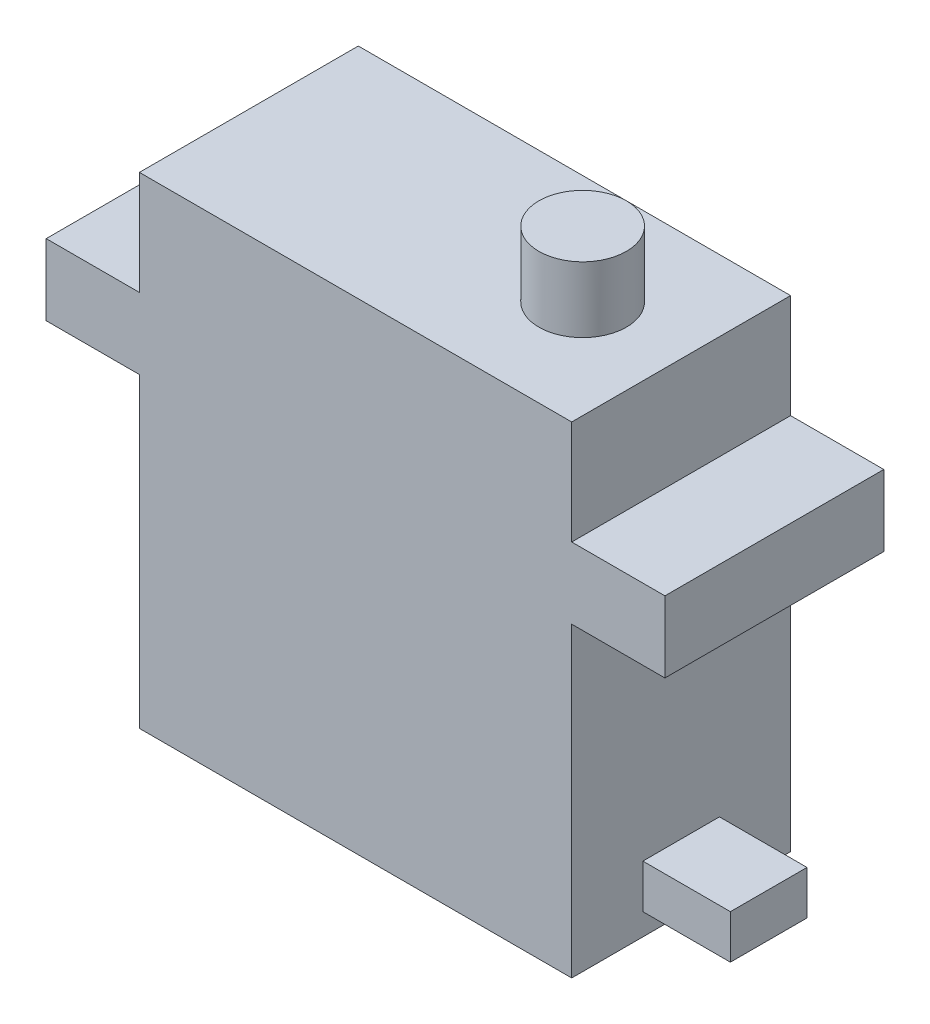
ISO-10303-21;
HEADER;
FILE_DESCRIPTION(('STEP AP214'),'2;1');
FILE_NAME('part.step','',(''),(''),'','','');
FILE_SCHEMA(('AUTOMOTIVE_DESIGN { 1 0 10303 214 1 1 1 1 }'));
ENDSEC;
DATA;
#1=APPLICATION_CONTEXT('core data for automotive mechanical design processes');
#2=APPLICATION_PROTOCOL_DEFINITION('international standard','automotive_design',2000,#1);
#3=PRODUCT_CONTEXT('',#1,'mechanical');
#4=PRODUCT('Part','Part','',(#3));
#5=PRODUCT_RELATED_PRODUCT_CATEGORY('part','',(#4));
#6=PRODUCT_DEFINITION_FORMATION('','',#4);
#7=PRODUCT_DEFINITION_CONTEXT('part definition',#1,'design');
#8=PRODUCT_DEFINITION('design','',#6,#7);
#9=PRODUCT_DEFINITION_SHAPE('','',#8);
#10=(LENGTH_UNIT() NAMED_UNIT(*) SI_UNIT(.MILLI.,.METRE.));
#11=(NAMED_UNIT(*) PLANE_ANGLE_UNIT() SI_UNIT($,.RADIAN.));
#12=(NAMED_UNIT(*) SI_UNIT($,.STERADIAN.) SOLID_ANGLE_UNIT());
#13=UNCERTAINTY_MEASURE_WITH_UNIT(LENGTH_MEASURE(1.E-05),#10,'distance_accuracy_value','');
#14=(GEOMETRIC_REPRESENTATION_CONTEXT(3) GLOBAL_UNCERTAINTY_ASSIGNED_CONTEXT((#13)) GLOBAL_UNIT_ASSIGNED_CONTEXT((#10,
#11,#12)) REPRESENTATION_CONTEXT('',''));
#15=CARTESIAN_POINT('',(0.,0.,0.));
#16=DIRECTION('',(0.,0.,1.));
#17=DIRECTION('',(1.,0.,0.));
#18=AXIS2_PLACEMENT_3D('',#15,#16,#17);
#19=CARTESIAN_POINT('',(-3.65124455522354,28.,-19.0286705047429));
#20=DIRECTION('',(-1.,0.,0.));
#21=DIRECTION('',(0.,0.,1.));
#22=AXIS2_PLACEMENT_3D('',#19,#20,#21);
#23=PLANE('',#22);
#24=DIRECTION('',(0.,0.,-1.));
#25=VECTOR('',#24,1.);
#26=CARTESIAN_POINT('',(-3.65124455522354,0.,-19.0286705047429));
#27=LINE('',#26,#25);
#28=CARTESIAN_POINT('',(-3.65124455522354,0.,0.971329495257144));
#29=VERTEX_POINT('',#28);
#30=CARTESIAN_POINT('',(-3.65124455522354,0.,-19.0286705047429));
#31=VERTEX_POINT('',#30);
#32=EDGE_CURVE('E272',#29,#31,#27,.T.);
#33=ORIENTED_EDGE('',*,*,#32,.T.);
#34=DIRECTION('',(0.,-1.,0.));
#35=VECTOR('',#34,1.);
#36=CARTESIAN_POINT('',(-3.65124455522354,28.,-19.0286705047429));
#37=LINE('',#36,#35);
#38=CARTESIAN_POINT('',(-3.65124455522354,28.,-19.0286705047429));
#39=VERTEX_POINT('',#38);
#40=EDGE_CURVE('E277',#39,#31,#37,.T.);
#41=ORIENTED_EDGE('',*,*,#40,.F.);
#42=DIRECTION('',(0.,0.,-1.));
#43=VECTOR('',#42,1.);
#44=CARTESIAN_POINT('',(-3.65124455522354,28.,-19.0286705047429));
#45=LINE('',#44,#43);
#46=CARTESIAN_POINT('',(-3.65124455522354,28.,0.971329495257144));
#47=VERTEX_POINT('',#46);
#48=EDGE_CURVE('E263',#47,#39,#45,.T.);
#49=ORIENTED_EDGE('',*,*,#48,.F.);
#50=DIRECTION('',(0.,-1.,0.));
#51=VECTOR('',#50,1.);
#52=CARTESIAN_POINT('',(-3.65124455522354,28.,0.971329495257144));
#53=LINE('',#52,#51);
#54=EDGE_CURVE('E280',#47,#29,#53,.T.);
#55=ORIENTED_EDGE('',*,*,#54,.T.);
#56=EDGE_LOOP('',(#33,#41,#49,#55));
#57=FACE_BOUND('',#56,.T.);
#58=DIRECTION('',(0.,0.,-1.));
#59=VECTOR('',#58,1.);
#60=CARTESIAN_POINT('',(-3.65124455522354,2.,-5.52867050474286));
#61=LINE('',#60,#59);
#62=CARTESIAN_POINT('',(-3.65124455522354,2.,-5.52867050474286));
#63=VERTEX_POINT('',#62);
#64=CARTESIAN_POINT('',(-3.65124455522354,2.,-12.5286705047429));
#65=VERTEX_POINT('',#64);
#66=EDGE_CURVE('E170',#63,#65,#61,.T.);
#67=ORIENTED_EDGE('',*,*,#66,.F.);
#68=DIRECTION('',(0.,-1.,0.));
#69=VECTOR('',#68,1.);
#70=CARTESIAN_POINT('',(-3.65124455522354,6.,-5.52867050474286));
#71=LINE('',#70,#69);
#72=CARTESIAN_POINT('',(-3.65124455522354,6.,-5.52867050474286));
#73=VERTEX_POINT('',#72);
#74=EDGE_CURVE('E165',#73,#63,#71,.T.);
#75=ORIENTED_EDGE('',*,*,#74,.F.);
#76=DIRECTION('',(0.,0.,-1.));
#77=VECTOR('',#76,1.);
#78=CARTESIAN_POINT('',(-3.65124455522354,6.,-5.52867050474286));
#79=LINE('',#78,#77);
#80=CARTESIAN_POINT('',(-3.65124455522354,6.,-12.5286705047429));
#81=VERTEX_POINT('',#80);
#82=EDGE_CURVE('E61',#73,#81,#79,.T.);
#83=ORIENTED_EDGE('',*,*,#82,.T.);
#84=DIRECTION('',(0.,-1.,0.));
#85=VECTOR('',#84,1.);
#86=CARTESIAN_POINT('',(-3.65124455522354,6.,-12.5286705047429));
#87=LINE('',#86,#85);
#88=EDGE_CURVE('E56',#81,#65,#87,.T.);
#89=ORIENTED_EDGE('',*,*,#88,.T.);
#90=EDGE_LOOP('',(#67,#75,#83,#89));
#91=FACE_BOUND('',#90,.T.);
#92=ADVANCED_FACE('F41',(#57,#91),#23,.F.);
#93=CARTESIAN_POINT('',(0.,34.5,0.));
#94=DIRECTION('',(0.,-1.,0.));
#95=DIRECTION('',(0.,0.,-1.));
#96=AXIS2_PLACEMENT_3D('',#93,#94,#95);
#97=PLANE('',#96);
#98=DIRECTION('',(0.,0.,1.));
#99=VECTOR('',#98,1.);
#100=CARTESIAN_POINT('',(-43.1512445552235,34.5,-19.0286705047429));
#101=LINE('',#100,#99);
#102=CARTESIAN_POINT('',(-43.1512445552235,34.5,-19.0286705047429));
#103=VERTEX_POINT('',#102);
#104=CARTESIAN_POINT('',(-43.1512445552235,34.5,0.971329495257144));
#105=VERTEX_POINT('',#104);
#106=EDGE_CURVE('E199',#103,#105,#101,.T.);
#107=ORIENTED_EDGE('',*,*,#106,.F.);
#108=DIRECTION('',(1.,0.,0.));
#109=VECTOR('',#108,1.);
#110=CARTESIAN_POINT('',(-3.65124455522354,34.5,-19.0286705047429));
#111=LINE('',#110,#109);
#112=CARTESIAN_POINT('',(-51.6681800207115,34.5,-19.0286705047429));
#113=VERTEX_POINT('',#112);
#114=EDGE_CURVE('E230',#113,#103,#111,.T.);
#115=ORIENTED_EDGE('',*,*,#114,.F.);
#116=DIRECTION('',(0.,0.,1.));
#117=VECTOR('',#116,1.);
#118=CARTESIAN_POINT('',(-51.6681800207115,34.5,-19.0286705047429));
#119=LINE('',#118,#117);
#120=CARTESIAN_POINT('',(-51.6681800207115,34.5,0.971329495257144));
#121=VERTEX_POINT('',#120);
#122=EDGE_CURVE('E233',#113,#121,#119,.T.);
#123=ORIENTED_EDGE('',*,*,#122,.T.);
#124=DIRECTION('',(1.,0.,0.));
#125=VECTOR('',#124,1.);
#126=CARTESIAN_POINT('',(-51.6681800207115,34.5,0.971329495257144));
#127=LINE('',#126,#125);
#128=EDGE_CURVE('E223',#121,#105,#127,.T.);
#129=ORIENTED_EDGE('',*,*,#128,.T.);
#130=EDGE_LOOP('',(#107,#115,#123,#129));
#131=FACE_BOUND('',#130,.T.);
#132=ADVANCED_FACE('F324',(#131),#97,.F.);
#133=CARTESIAN_POINT('',(-43.1512445552235,28.,-19.0286705047429));
#134=DIRECTION('',(1.,0.,0.));
#135=DIRECTION('',(0.,0.,-1.));
#136=AXIS2_PLACEMENT_3D('',#133,#134,#135);
#137=PLANE('',#136);
#138=DIRECTION('',(0.,0.,1.));
#139=VECTOR('',#138,1.);
#140=CARTESIAN_POINT('',(-43.1512445552235,0.,-19.0286705047429));
#141=LINE('',#140,#139);
#142=CARTESIAN_POINT('',(-43.1512445552235,0.,-19.0286705047429));
#143=VERTEX_POINT('',#142);
#144=CARTESIAN_POINT('',(-43.1512445552235,0.,0.971329495257144));
#145=VERTEX_POINT('',#144);
#146=EDGE_CURVE('E259',#143,#145,#141,.T.);
#147=ORIENTED_EDGE('',*,*,#146,.T.);
#148=DIRECTION('',(0.,-1.,0.));
#149=VECTOR('',#148,1.);
#150=CARTESIAN_POINT('',(-43.1512445552235,28.,0.971329495257144));
#151=LINE('',#150,#149);
#152=CARTESIAN_POINT('',(-43.1512445552235,28.,0.971329495257144));
#153=VERTEX_POINT('',#152);
#154=EDGE_CURVE('E49',#153,#145,#151,.T.);
#155=ORIENTED_EDGE('',*,*,#154,.F.);
#156=DIRECTION('',(0.,0.,1.));
#157=VECTOR('',#156,1.);
#158=CARTESIAN_POINT('',(-43.1512445552235,28.,-19.0286705047429));
#159=LINE('',#158,#157);
#160=CARTESIAN_POINT('',(-43.1512445552235,28.,-19.0286705047429));
#161=VERTEX_POINT('',#160);
#162=EDGE_CURVE('E260',#161,#153,#159,.T.);
#163=ORIENTED_EDGE('',*,*,#162,.F.);
#164=DIRECTION('',(0.,-1.,0.));
#165=VECTOR('',#164,1.);
#166=CARTESIAN_POINT('',(-43.1512445552235,28.,-19.0286705047429));
#167=LINE('',#166,#165);
#168=EDGE_CURVE('E267',#161,#143,#167,.T.);
#169=ORIENTED_EDGE('',*,*,#168,.T.);
#170=EDGE_LOOP('',(#147,#155,#163,#169));
#171=FACE_BOUND('',#170,.T.);
#172=ADVANCED_FACE('F43',(#171),#137,.F.);
#173=CARTESIAN_POINT('',(-43.1512445552235,28.,0.971329495257144));
#174=DIRECTION('',(0.,0.,-1.));
#175=DIRECTION('',(-1.,0.,0.));
#176=AXIS2_PLACEMENT_3D('',#173,#174,#175);
#177=PLANE('',#176);
#178=DIRECTION('',(1.,0.,0.));
#179=VECTOR('',#178,1.);
#180=CARTESIAN_POINT('',(-43.1512445552235,0.,0.971329495257144));
#181=LINE('',#180,#179);
#182=EDGE_CURVE('E270',#145,#29,#181,.T.);
#183=ORIENTED_EDGE('',*,*,#182,.T.);
#184=ORIENTED_EDGE('',*,*,#54,.F.);
#185=DIRECTION('',(-1.,0.,0.));
#186=VECTOR('',#185,1.);
#187=CARTESIAN_POINT('',(4.86569091026446,28.,0.971329495257144));
#188=LINE('',#187,#186);
#189=CARTESIAN_POINT('',(4.86569091026446,28.,0.971329495257144));
#190=VERTEX_POINT('',#189);
#191=EDGE_CURVE('E236',#190,#47,#188,.T.);
#192=ORIENTED_EDGE('',*,*,#191,.F.);
#193=DIRECTION('',(0.,-1.,0.));
#194=VECTOR('',#193,1.);
#195=CARTESIAN_POINT('',(4.86569091026446,34.5,0.971329495257144));
#196=LINE('',#195,#194);
#197=CARTESIAN_POINT('',(4.86569091026446,34.5,0.971329495257144));
#198=VERTEX_POINT('',#197);
#199=EDGE_CURVE('E257',#198,#190,#196,.T.);
#200=ORIENTED_EDGE('',*,*,#199,.F.);
#201=CARTESIAN_POINT('',(-3.65124455522353,34.5,0.971329495257144));
#202=VERTEX_POINT('',#201);
#203=EDGE_CURVE('E226',#202,#198,#127,.T.);
#204=ORIENTED_EDGE('',*,*,#203,.F.);
#205=DIRECTION('',(0.,-1.,0.));
#206=VECTOR('',#205,1.);
#207=CARTESIAN_POINT('',(-3.65124455522353,44.,0.971329495257139));
#208=LINE('',#207,#206);
#209=CARTESIAN_POINT('',(-3.65124455522353,44.,0.971329495257139));
#210=VERTEX_POINT('',#209);
#211=EDGE_CURVE('E218',#210,#202,#208,.T.);
#212=ORIENTED_EDGE('',*,*,#211,.F.);
#213=DIRECTION('',(-1.,0.,0.));
#214=VECTOR('',#213,1.);
#215=CARTESIAN_POINT('',(-3.65124455522353,44.,0.971329495257139));
#216=LINE('',#215,#214);
#217=CARTESIAN_POINT('',(-43.1512445552235,44.,0.971329495257144));
#218=VERTEX_POINT('',#217);
#219=EDGE_CURVE('E202',#210,#218,#216,.T.);
#220=ORIENTED_EDGE('',*,*,#219,.T.);
#221=DIRECTION('',(0.,-1.,0.));
#222=VECTOR('',#221,1.);
#223=CARTESIAN_POINT('',(-43.1512445552235,44.,0.971329495257144));
#224=LINE('',#223,#222);
#225=EDGE_CURVE('E215',#218,#105,#224,.T.);
#226=ORIENTED_EDGE('',*,*,#225,.T.);
#227=ORIENTED_EDGE('',*,*,#128,.F.);
#228=DIRECTION('',(0.,-1.,0.));
#229=VECTOR('',#228,1.);
#230=CARTESIAN_POINT('',(-51.6681800207115,34.5,0.971329495257144));
#231=LINE('',#230,#229);
#232=CARTESIAN_POINT('',(-51.6681800207115,28.,0.971329495257144));
#233=VERTEX_POINT('',#232);
#234=EDGE_CURVE('E235',#121,#233,#231,.T.);
#235=ORIENTED_EDGE('',*,*,#234,.T.);
#236=EDGE_CURVE('E214',#153,#233,#188,.T.);
#237=ORIENTED_EDGE('',*,*,#236,.F.);
#238=ORIENTED_EDGE('',*,*,#154,.T.);
#239=EDGE_LOOP('',(#183,#184,#192,#200,#204,#212,#220,#226,#227,#235,#237,#238));
#240=FACE_BOUND('',#239,.T.);
#241=ADVANCED_FACE('F285',(#240),#177,.F.);
#242=CARTESIAN_POINT('',(-43.1512445552235,28.,-19.0286705047429));
#243=DIRECTION('',(0.,0.,1.));
#244=DIRECTION('',(1.,0.,0.));
#245=AXIS2_PLACEMENT_3D('',#242,#243,#244);
#246=PLANE('',#245);
#247=DIRECTION('',(-1.,0.,0.));
#248=VECTOR('',#247,1.);
#249=CARTESIAN_POINT('',(-43.1512445552235,0.,-19.0286705047429));
#250=LINE('',#249,#248);
#251=EDGE_CURVE('E264',#31,#143,#250,.T.);
#252=ORIENTED_EDGE('',*,*,#251,.T.);
#253=ORIENTED_EDGE('',*,*,#168,.F.);
#254=DIRECTION('',(-1.,0.,0.));
#255=VECTOR('',#254,1.);
#256=CARTESIAN_POINT('',(-43.1512445552235,28.,-19.0286705047429));
#257=LINE('',#256,#255);
#258=CARTESIAN_POINT('',(-51.6681800207115,28.,-19.0286705047429));
#259=VERTEX_POINT('',#258);
#260=EDGE_CURVE('E242',#161,#259,#257,.T.);
#261=ORIENTED_EDGE('',*,*,#260,.T.);
#262=DIRECTION('',(0.,-1.,0.));
#263=VECTOR('',#262,1.);
#264=CARTESIAN_POINT('',(-51.6681800207115,34.5,-19.0286705047429));
#265=LINE('',#264,#263);
#266=EDGE_CURVE('E251',#113,#259,#265,.T.);
#267=ORIENTED_EDGE('',*,*,#266,.F.);
#268=ORIENTED_EDGE('',*,*,#114,.T.);
#269=DIRECTION('',(0.,-1.,0.));
#270=VECTOR('',#269,1.);
#271=CARTESIAN_POINT('',(-43.1512445552235,44.,-19.0286705047429));
#272=LINE('',#271,#270);
#273=CARTESIAN_POINT('',(-43.1512445552235,44.,-19.0286705047429));
#274=VERTEX_POINT('',#273);
#275=EDGE_CURVE('E211',#274,#103,#272,.T.);
#276=ORIENTED_EDGE('',*,*,#275,.F.);
#277=DIRECTION('',(1.,0.,0.));
#278=VECTOR('',#277,1.);
#279=CARTESIAN_POINT('',(-43.1512445552235,44.,-19.0286705047429));
#280=LINE('',#279,#278);
#281=CARTESIAN_POINT('',(-3.65124455522354,44.,-19.0286705047429));
#282=VERTEX_POINT('',#281);
#283=EDGE_CURVE('E195',#274,#282,#280,.T.);
#284=ORIENTED_EDGE('',*,*,#283,.T.);
#285=DIRECTION('',(0.,-1.,0.));
#286=VECTOR('',#285,1.);
#287=CARTESIAN_POINT('',(-3.65124455522354,44.,-19.0286705047429));
#288=LINE('',#287,#286);
#289=CARTESIAN_POINT('',(-3.65124455522354,34.5,-19.0286705047429));
#290=VERTEX_POINT('',#289);
#291=EDGE_CURVE('E207',#282,#290,#288,.T.);
#292=ORIENTED_EDGE('',*,*,#291,.T.);
#293=CARTESIAN_POINT('',(4.86569091026446,34.5,-19.0286705047429));
#294=VERTEX_POINT('',#293);
#295=EDGE_CURVE('E229',#290,#294,#111,.T.);
#296=ORIENTED_EDGE('',*,*,#295,.T.);
#297=DIRECTION('',(0.,-1.,0.));
#298=VECTOR('',#297,1.);
#299=CARTESIAN_POINT('',(4.86569091026446,34.5,-19.0286705047429));
#300=LINE('',#299,#298);
#301=CARTESIAN_POINT('',(4.86569091026446,28.,-19.0286705047429));
#302=VERTEX_POINT('',#301);
#303=EDGE_CURVE('E254',#294,#302,#300,.T.);
#304=ORIENTED_EDGE('',*,*,#303,.T.);
#305=EDGE_CURVE('E243',#302,#39,#257,.T.);
#306=ORIENTED_EDGE('',*,*,#305,.T.);
#307=ORIENTED_EDGE('',*,*,#40,.T.);
#308=EDGE_LOOP('',(#252,#253,#261,#267,#268,#276,#284,#292,#296,#304,#306,#307));
#309=FACE_BOUND('',#308,.T.);
#310=ADVANCED_FACE('F296',(#309),#246,.F.);
#311=CARTESIAN_POINT('',(0.,0.,0.));
#312=DIRECTION('',(0.,1.,0.));
#313=DIRECTION('',(0.,0.,1.));
#314=AXIS2_PLACEMENT_3D('',#311,#312,#313);
#315=PLANE('',#314);
#316=ORIENTED_EDGE('',*,*,#146,.F.);
#317=ORIENTED_EDGE('',*,*,#251,.F.);
#318=ORIENTED_EDGE('',*,*,#32,.F.);
#319=ORIENTED_EDGE('',*,*,#182,.F.);
#320=EDGE_LOOP('',(#316,#317,#318,#319));
#321=FACE_BOUND('',#320,.T.);
#322=ADVANCED_FACE('F291',(#321),#315,.F.);
#323=CARTESIAN_POINT('',(0.,28.,0.));
#324=DIRECTION('',(0.,-1.,0.));
#325=DIRECTION('',(0.,0.,-1.));
#326=AXIS2_PLACEMENT_3D('',#323,#324,#325);
#327=PLANE('',#326);
#328=ORIENTED_EDGE('',*,*,#260,.F.);
#329=ORIENTED_EDGE('',*,*,#162,.T.);
#330=ORIENTED_EDGE('',*,*,#236,.T.);
#331=DIRECTION('',(0.,0.,1.));
#332=VECTOR('',#331,1.);
#333=CARTESIAN_POINT('',(-51.6681800207115,28.,-19.0286705047429));
#334=LINE('',#333,#332);
#335=EDGE_CURVE('E246',#259,#233,#334,.T.);
#336=ORIENTED_EDGE('',*,*,#335,.F.);
#337=EDGE_LOOP('',(#328,#329,#330,#336));
#338=FACE_BOUND('',#337,.T.);
#339=ADVANCED_FACE('F332',(#338),#327,.T.);
#340=CARTESIAN_POINT('',(4.86569091026446,34.5,-19.0286705047429));
#341=DIRECTION('',(1.,0.,0.));
#342=DIRECTION('',(0.,0.,-1.));
#343=AXIS2_PLACEMENT_3D('',#340,#341,#342);
#344=PLANE('',#343);
#345=DIRECTION('',(0.,0.,1.));
#346=VECTOR('',#345,1.);
#347=CARTESIAN_POINT('',(4.86569091026446,28.,-19.0286705047429));
#348=LINE('',#347,#346);
#349=EDGE_CURVE('E239',#302,#190,#348,.T.);
#350=ORIENTED_EDGE('',*,*,#349,.F.);
#351=ORIENTED_EDGE('',*,*,#303,.F.);
#352=DIRECTION('',(0.,0.,1.));
#353=VECTOR('',#352,1.);
#354=CARTESIAN_POINT('',(4.86569091026446,34.5,-19.0286705047429));
#355=LINE('',#354,#353);
#356=EDGE_CURVE('E225',#294,#198,#355,.T.);
#357=ORIENTED_EDGE('',*,*,#356,.T.);
#358=ORIENTED_EDGE('',*,*,#199,.T.);
#359=EDGE_LOOP('',(#350,#351,#357,#358));
#360=FACE_BOUND('',#359,.T.);
#361=ADVANCED_FACE('F306',(#360),#344,.T.);
#362=CARTESIAN_POINT('',(-51.6681800207115,34.5,-19.0286705047429));
#363=DIRECTION('',(1.,0.,0.));
#364=DIRECTION('',(0.,0.,-1.));
#365=AXIS2_PLACEMENT_3D('',#362,#363,#364);
#366=PLANE('',#365);
#367=ORIENTED_EDGE('',*,*,#335,.T.);
#368=ORIENTED_EDGE('',*,*,#234,.F.);
#369=ORIENTED_EDGE('',*,*,#122,.F.);
#370=ORIENTED_EDGE('',*,*,#266,.T.);
#371=EDGE_LOOP('',(#367,#368,#369,#370));
#372=FACE_BOUND('',#371,.T.);
#373=ADVANCED_FACE('F328',(#372),#366,.F.);
#374=ORIENTED_EDGE('',*,*,#295,.F.);
#375=DIRECTION('',(0.,0.,1.));
#376=VECTOR('',#375,1.);
#377=CARTESIAN_POINT('',(-3.65124455522354,34.5,-19.0286705047429));
#378=LINE('',#377,#376);
#379=EDGE_CURVE('E194',#290,#202,#378,.T.);
#380=ORIENTED_EDGE('',*,*,#379,.T.);
#381=ORIENTED_EDGE('',*,*,#203,.T.);
#382=ORIENTED_EDGE('',*,*,#356,.F.);
#383=EDGE_LOOP('',(#374,#380,#381,#382));
#384=FACE_BOUND('',#383,.T.);
#385=ADVANCED_FACE('F308',(#384),#97,.F.);
#386=ORIENTED_EDGE('',*,*,#191,.T.);
#387=ORIENTED_EDGE('',*,*,#48,.T.);
#388=ORIENTED_EDGE('',*,*,#305,.F.);
#389=ORIENTED_EDGE('',*,*,#349,.T.);
#390=EDGE_LOOP('',(#386,#387,#388,#389));
#391=FACE_BOUND('',#390,.T.);
#392=ADVANCED_FACE('F300',(#391),#327,.T.);
#393=CARTESIAN_POINT('',(-43.1512445552235,44.,-19.0286705047429));
#394=DIRECTION('',(1.,0.,0.));
#395=DIRECTION('',(0.,0.,-1.));
#396=AXIS2_PLACEMENT_3D('',#393,#394,#395);
#397=PLANE('',#396);
#398=ORIENTED_EDGE('',*,*,#106,.T.);
#399=ORIENTED_EDGE('',*,*,#225,.F.);
#400=DIRECTION('',(0.,0.,1.));
#401=VECTOR('',#400,1.);
#402=CARTESIAN_POINT('',(-43.1512445552235,44.,-19.0286705047429));
#403=LINE('',#402,#401);
#404=EDGE_CURVE('E205',#274,#218,#403,.T.);
#405=ORIENTED_EDGE('',*,*,#404,.F.);
#406=ORIENTED_EDGE('',*,*,#275,.T.);
#407=EDGE_LOOP('',(#398,#399,#405,#406));
#408=FACE_BOUND('',#407,.T.);
#409=ADVANCED_FACE('F320',(#408),#397,.F.);
#410=CARTESIAN_POINT('',(-3.65124455522354,44.,-19.0286705047429));
#411=DIRECTION('',(1.,0.,0.));
#412=DIRECTION('',(0.,0.,-1.));
#413=AXIS2_PLACEMENT_3D('',#410,#411,#412);
#414=PLANE('',#413);
#415=ORIENTED_EDGE('',*,*,#379,.F.);
#416=ORIENTED_EDGE('',*,*,#291,.F.);
#417=DIRECTION('',(0.,0.,1.));
#418=VECTOR('',#417,1.);
#419=CARTESIAN_POINT('',(-3.65124455522354,44.,-19.0286705047429));
#420=LINE('',#419,#418);
#421=EDGE_CURVE('E198',#282,#210,#420,.T.);
#422=ORIENTED_EDGE('',*,*,#421,.T.);
#423=ORIENTED_EDGE('',*,*,#211,.T.);
#424=EDGE_LOOP('',(#415,#416,#422,#423));
#425=FACE_BOUND('',#424,.T.);
#426=ADVANCED_FACE('F311',(#425),#414,.T.);
#427=CARTESIAN_POINT('',(0.,44.,0.));
#428=DIRECTION('',(0.,-1.,0.));
#429=DIRECTION('',(0.,0.,-1.));
#430=AXIS2_PLACEMENT_3D('',#427,#428,#429);
#431=PLANE('',#430);
#432=CARTESIAN_POINT('',(-12.6512445552235,44.,-9.02867050474286));
#433=DIRECTION('',(0.,-1.,0.));
#434=DIRECTION('',(0.,0.,-1.));
#435=AXIS2_PLACEMENT_3D('',#432,#433,#434);
#436=CIRCLE('',#435,4.);
#437=CARTESIAN_POINT('',(-12.6512445552235,44.,-13.0286705047429));
#438=VERTEX_POINT('',#437);
#439=EDGE_CURVE('E11',#438,#438,#436,.F.);
#440=ORIENTED_EDGE('',*,*,#439,.F.);
#441=EDGE_LOOP('',(#440));
#442=FACE_BOUND('',#441,.T.);
#443=ORIENTED_EDGE('',*,*,#283,.F.);
#444=ORIENTED_EDGE('',*,*,#404,.T.);
#445=ORIENTED_EDGE('',*,*,#219,.F.);
#446=ORIENTED_EDGE('',*,*,#421,.F.);
#447=EDGE_LOOP('',(#443,#444,#445,#446));
#448=FACE_BOUND('',#447,.T.);
#449=ADVANCED_FACE('F316',(#442,#448),#431,.F.);
#450=CARTESIAN_POINT('',(-12.6512445552235,50.,-9.02867050474286));
#451=DIRECTION('',(0.,-1.,0.));
#452=DIRECTION('',(0.,0.,-1.));
#453=AXIS2_PLACEMENT_3D('',#450,#451,#452);
#454=CYLINDRICAL_SURFACE('',#453,4.);
#455=CARTESIAN_POINT('',(-12.6512445552235,50.,-9.02867050474286));
#456=DIRECTION('',(0.,1.,0.));
#457=DIRECTION('',(0.,0.,1.));
#458=AXIS2_PLACEMENT_3D('',#455,#456,#457);
#459=CIRCLE('',#458,4.);
#460=CARTESIAN_POINT('',(-12.6512445552235,50.,-5.02867050474286));
#461=VERTEX_POINT('',#460);
#462=EDGE_CURVE('E172',#461,#461,#459,.T.);
#463=ORIENTED_EDGE('',*,*,#462,.F.);
#464=EDGE_LOOP('',(#463));
#465=FACE_BOUND('',#464,.T.);
#466=ORIENTED_EDGE('',*,*,#439,.T.);
#467=EDGE_LOOP('',(#466));
#468=FACE_BOUND('',#467,.T.);
#469=ADVANCED_FACE('F454',(#465,#468),#454,.T.);
#470=CARTESIAN_POINT('',(-12.6512445552235,50.,-9.02867050474286));
#471=DIRECTION('',(0.,1.,0.));
#472=DIRECTION('',(0.,0.,1.));
#473=AXIS2_PLACEMENT_3D('',#470,#471,#472);
#474=PLANE('',#473);
#475=ORIENTED_EDGE('',*,*,#462,.T.);
#476=EDGE_LOOP('',(#475));
#477=FACE_BOUND('',#476,.T.);
#478=ADVANCED_FACE('F463',(#477),#474,.T.);
#479=CARTESIAN_POINT('',(4.34875544477646,2.,-5.52867050474286));
#480=DIRECTION('',(0.,1.,0.));
#481=DIRECTION('',(0.,0.,1.));
#482=AXIS2_PLACEMENT_3D('',#479,#480,#481);
#483=PLANE('',#482);
#484=ORIENTED_EDGE('',*,*,#66,.T.);
#485=DIRECTION('',(-1.,0.,0.));
#486=VECTOR('',#485,1.);
#487=CARTESIAN_POINT('',(4.34875544477646,2.,-12.5286705047429));
#488=LINE('',#487,#486);
#489=CARTESIAN_POINT('',(4.34875544477646,2.,-12.5286705047429));
#490=VERTEX_POINT('',#489);
#491=EDGE_CURVE('E168',#490,#65,#488,.T.);
#492=ORIENTED_EDGE('',*,*,#491,.F.);
#493=DIRECTION('',(0.,0.,-1.));
#494=VECTOR('',#493,1.);
#495=CARTESIAN_POINT('',(4.34875544477646,2.,-5.52867050474286));
#496=LINE('',#495,#494);
#497=CARTESIAN_POINT('',(4.34875544477646,2.,-5.52867050474286));
#498=VERTEX_POINT('',#497);
#499=EDGE_CURVE('E153',#498,#490,#496,.T.);
#500=ORIENTED_EDGE('',*,*,#499,.F.);
#501=DIRECTION('',(-1.,0.,0.));
#502=VECTOR('',#501,1.);
#503=CARTESIAN_POINT('',(4.34875544477646,2.,-5.52867050474286));
#504=LINE('',#503,#502);
#505=EDGE_CURVE('E181',#498,#63,#504,.T.);
#506=ORIENTED_EDGE('',*,*,#505,.T.);
#507=EDGE_LOOP('',(#484,#492,#500,#506));
#508=FACE_BOUND('',#507,.T.);
#509=ADVANCED_FACE('F169',(#508),#483,.F.);
#510=CARTESIAN_POINT('',(4.34875544477646,6.,-12.5286705047429));
#511=DIRECTION('',(0.,0.,-1.));
#512=DIRECTION('',(-1.,0.,0.));
#513=AXIS2_PLACEMENT_3D('',#510,#511,#512);
#514=PLANE('',#513);
#515=ORIENTED_EDGE('',*,*,#88,.F.);
#516=DIRECTION('',(-1.,0.,0.));
#517=VECTOR('',#516,1.);
#518=CARTESIAN_POINT('',(4.34875544477646,6.,-12.5286705047429));
#519=LINE('',#518,#517);
#520=CARTESIAN_POINT('',(4.34875544477646,6.,-12.5286705047429));
#521=VERTEX_POINT('',#520);
#522=EDGE_CURVE('E173',#521,#81,#519,.T.);
#523=ORIENTED_EDGE('',*,*,#522,.F.);
#524=DIRECTION('',(0.,-1.,0.));
#525=VECTOR('',#524,1.);
#526=CARTESIAN_POINT('',(4.34875544477646,6.,-12.5286705047429));
#527=LINE('',#526,#525);
#528=EDGE_CURVE('E158',#521,#490,#527,.T.);
#529=ORIENTED_EDGE('',*,*,#528,.T.);
#530=ORIENTED_EDGE('',*,*,#491,.T.);
#531=EDGE_LOOP('',(#515,#523,#529,#530));
#532=FACE_BOUND('',#531,.T.);
#533=ADVANCED_FACE('F175',(#532),#514,.T.);
#534=CARTESIAN_POINT('',(4.34875544477646,6.,-5.52867050474286));
#535=DIRECTION('',(0.,1.,0.));
#536=DIRECTION('',(0.,0.,1.));
#537=AXIS2_PLACEMENT_3D('',#534,#535,#536);
#538=PLANE('',#537);
#539=ORIENTED_EDGE('',*,*,#82,.F.);
#540=DIRECTION('',(-1.,0.,0.));
#541=VECTOR('',#540,1.);
#542=CARTESIAN_POINT('',(4.34875544477646,6.,-5.52867050474286));
#543=LINE('',#542,#541);
#544=CARTESIAN_POINT('',(4.34875544477646,6.,-5.52867050474286));
#545=VERTEX_POINT('',#544);
#546=EDGE_CURVE('E188',#545,#73,#543,.T.);
#547=ORIENTED_EDGE('',*,*,#546,.F.);
#548=DIRECTION('',(0.,0.,-1.));
#549=VECTOR('',#548,1.);
#550=CARTESIAN_POINT('',(4.34875544477646,6.,-5.52867050474286));
#551=LINE('',#550,#549);
#552=EDGE_CURVE('E176',#545,#521,#551,.T.);
#553=ORIENTED_EDGE('',*,*,#552,.T.);
#554=ORIENTED_EDGE('',*,*,#522,.T.);
#555=EDGE_LOOP('',(#539,#547,#553,#554));
#556=FACE_BOUND('',#555,.T.);
#557=ADVANCED_FACE('F489',(#556),#538,.T.);
#558=CARTESIAN_POINT('',(4.34875544477646,6.,-5.52867050474286));
#559=DIRECTION('',(0.,0.,-1.));
#560=DIRECTION('',(0.,1.,0.));
#561=AXIS2_PLACEMENT_3D('',#558,#559,#560);
#562=PLANE('',#561);
#563=ORIENTED_EDGE('',*,*,#74,.T.);
#564=ORIENTED_EDGE('',*,*,#505,.F.);
#565=DIRECTION('',(0.,-1.,0.));
#566=VECTOR('',#565,1.);
#567=CARTESIAN_POINT('',(4.34875544477646,6.,-5.52867050474286));
#568=LINE('',#567,#566);
#569=EDGE_CURVE('E161',#545,#498,#568,.T.);
#570=ORIENTED_EDGE('',*,*,#569,.F.);
#571=ORIENTED_EDGE('',*,*,#546,.T.);
#572=EDGE_LOOP('',(#563,#564,#570,#571));
#573=FACE_BOUND('',#572,.T.);
#574=ADVANCED_FACE('F497',(#573),#562,.F.);
#575=CARTESIAN_POINT('',(4.34875544477646,0.,0.));
#576=DIRECTION('',(-1.,0.,0.));
#577=DIRECTION('',(0.,0.,1.));
#578=AXIS2_PLACEMENT_3D('',#575,#576,#577);
#579=PLANE('',#578);
#580=ORIENTED_EDGE('',*,*,#499,.T.);
#581=ORIENTED_EDGE('',*,*,#528,.F.);
#582=ORIENTED_EDGE('',*,*,#552,.F.);
#583=ORIENTED_EDGE('',*,*,#569,.T.);
#584=EDGE_LOOP('',(#580,#581,#582,#583));
#585=FACE_BOUND('',#584,.T.);
#586=ADVANCED_FACE('F155',(#585),#579,.F.);
#587=CLOSED_SHELL('',(#92,#132,#172,#241,#310,#322,#339,#361,#373,#385,#392,#409,#426,#449,#469,
#478,#509,#533,#557,#574,#586));
#588=MANIFOLD_SOLID_BREP('B2',#587);
#589=ADVANCED_BREP_SHAPE_REPRESENTATION('',(#18,#588),#14);
#590=SHAPE_DEFINITION_REPRESENTATION(#9,#589);
ENDSEC;
END-ISO-10303-21;
